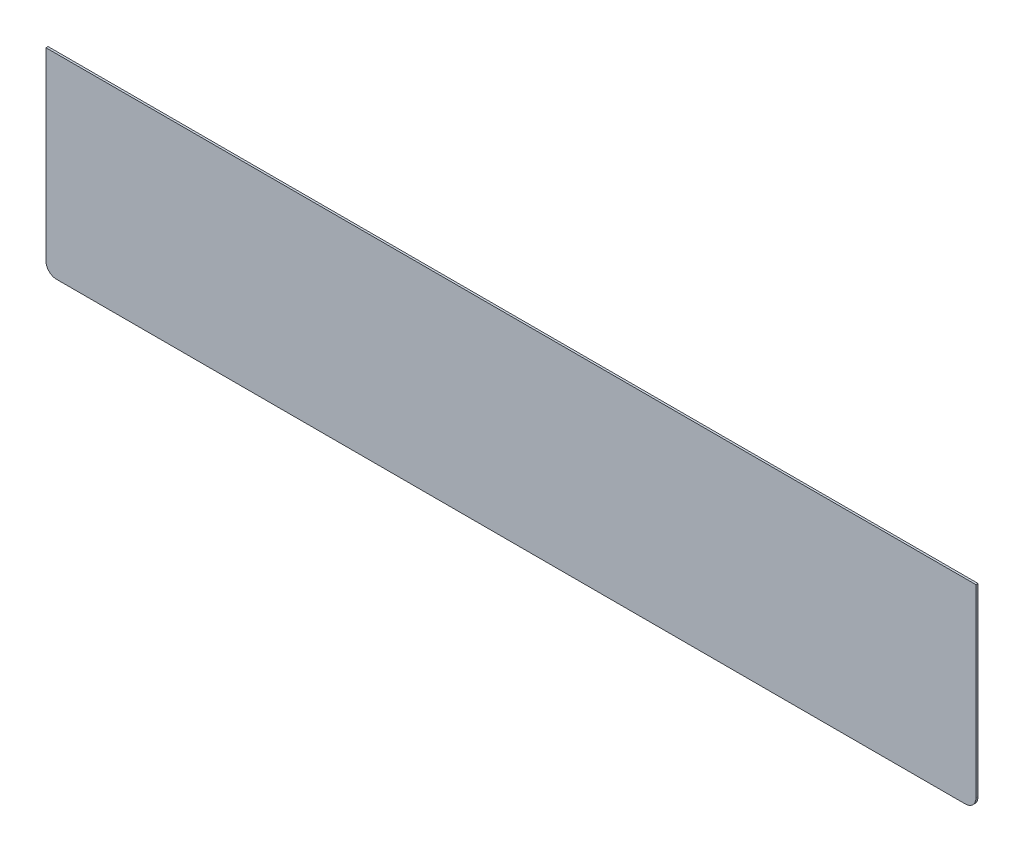
ISO-10303-21;
HEADER;
FILE_DESCRIPTION(('STEP AP214'),'2;1');
FILE_NAME('part.step','',(''),(''),'','','');
FILE_SCHEMA(('AUTOMOTIVE_DESIGN { 1 0 10303 214 1 1 1 1 }'));
ENDSEC;
DATA;
#1=APPLICATION_CONTEXT('core data for automotive mechanical design processes');
#2=APPLICATION_PROTOCOL_DEFINITION('international standard','automotive_design',2000,#1);
#3=PRODUCT_CONTEXT('',#1,'mechanical');
#4=PRODUCT('Part','Part','',(#3));
#5=PRODUCT_RELATED_PRODUCT_CATEGORY('part','',(#4));
#6=PRODUCT_DEFINITION_FORMATION('','',#4);
#7=PRODUCT_DEFINITION_CONTEXT('part definition',#1,'design');
#8=PRODUCT_DEFINITION('design','',#6,#7);
#9=PRODUCT_DEFINITION_SHAPE('','',#8);
#10=(LENGTH_UNIT() NAMED_UNIT(*) SI_UNIT(.MILLI.,.METRE.));
#11=(NAMED_UNIT(*) PLANE_ANGLE_UNIT() SI_UNIT($,.RADIAN.));
#12=(NAMED_UNIT(*) SI_UNIT($,.STERADIAN.) SOLID_ANGLE_UNIT());
#13=UNCERTAINTY_MEASURE_WITH_UNIT(LENGTH_MEASURE(1.E-05),#10,'distance_accuracy_value','');
#14=(GEOMETRIC_REPRESENTATION_CONTEXT(3) GLOBAL_UNCERTAINTY_ASSIGNED_CONTEXT((#13)) GLOBAL_UNIT_ASSIGNED_CONTEXT((#10,
#11,#12)) REPRESENTATION_CONTEXT('',''));
#15=CARTESIAN_POINT('',(0.,0.,0.));
#16=DIRECTION('',(0.,0.,1.));
#17=DIRECTION('',(1.,0.,0.));
#18=AXIS2_PLACEMENT_3D('',#15,#16,#17);
#19=CARTESIAN_POINT('',(220.8,182.985286799942,1.));
#20=DIRECTION('',(-1.,0.,0.));
#21=DIRECTION('',(0.,0.,1.));
#22=AXIS2_PLACEMENT_3D('',#19,#20,#21);
#23=PLANE('',#22);
#24=DIRECTION('',(0.,1.,0.));
#25=VECTOR('',#24,1.);
#26=CARTESIAN_POINT('',(220.8,182.985286799942,1.));
#27=LINE('',#26,#25);
#28=CARTESIAN_POINT('',(220.8,95.2486867999419,1.));
#29=VERTEX_POINT('',#28);
#30=CARTESIAN_POINT('',(220.8,182.985286799942,1.));
#31=VERTEX_POINT('',#30);
#32=EDGE_CURVE('E93',#29,#31,#27,.T.);
#33=ORIENTED_EDGE('',*,*,#32,.F.);
#34=DIRECTION('',(0.,0.,-1.));
#35=VECTOR('',#34,1.);
#36=CARTESIAN_POINT('',(220.8,95.2486867999419,1.));
#37=LINE('',#36,#35);
#38=CARTESIAN_POINT('',(220.8,95.2486867999419,0.));
#39=VERTEX_POINT('',#38);
#40=EDGE_CURVE('E134',#29,#39,#37,.T.);
#41=ORIENTED_EDGE('',*,*,#40,.T.);
#42=DIRECTION('',(0.,1.,0.));
#43=VECTOR('',#42,1.);
#44=CARTESIAN_POINT('',(220.8,182.985286799942,0.));
#45=LINE('',#44,#43);
#46=CARTESIAN_POINT('',(220.8,182.985286799942,0.));
#47=VERTEX_POINT('',#46);
#48=EDGE_CURVE('E125',#39,#47,#45,.T.);
#49=ORIENTED_EDGE('',*,*,#48,.T.);
#50=DIRECTION('',(0.,0.,-1.));
#51=VECTOR('',#50,1.);
#52=CARTESIAN_POINT('',(220.8,182.985286799942,1.));
#53=LINE('',#52,#51);
#54=EDGE_CURVE('E129',#31,#47,#53,.T.);
#55=ORIENTED_EDGE('',*,*,#54,.F.);
#56=EDGE_LOOP('',(#33,#41,#49,#55));
#57=FACE_BOUND('',#56,.T.);
#58=ADVANCED_FACE('F35',(#57),#23,.F.);
#59=CARTESIAN_POINT('',(220.8,182.985286799942,1.));
#60=DIRECTION('',(0.,-1.,0.));
#61=DIRECTION('',(1.,0.,0.));
#62=AXIS2_PLACEMENT_3D('',#59,#60,#61);
#63=PLANE('',#62);
#64=DIRECTION('',(-1.,0.,0.));
#65=VECTOR('',#64,1.);
#66=CARTESIAN_POINT('',(220.8,182.985286799942,0.));
#67=LINE('',#66,#65);
#68=CARTESIAN_POINT('',(-220.8,182.985286799942,0.));
#69=VERTEX_POINT('',#68);
#70=EDGE_CURVE('E103',#47,#69,#67,.T.);
#71=ORIENTED_EDGE('',*,*,#70,.T.);
#72=DIRECTION('',(0.,0.,-1.));
#73=VECTOR('',#72,1.);
#74=CARTESIAN_POINT('',(-220.8,182.985286799942,1.));
#75=LINE('',#74,#73);
#76=CARTESIAN_POINT('',(-220.8,182.985286799942,1.));
#77=VERTEX_POINT('',#76);
#78=EDGE_CURVE('E100',#77,#69,#75,.T.);
#79=ORIENTED_EDGE('',*,*,#78,.F.);
#80=DIRECTION('',(-1.,0.,0.));
#81=VECTOR('',#80,1.);
#82=CARTESIAN_POINT('',(220.8,182.985286799942,1.));
#83=LINE('',#82,#81);
#84=EDGE_CURVE('E86',#31,#77,#83,.T.);
#85=ORIENTED_EDGE('',*,*,#84,.F.);
#86=ORIENTED_EDGE('',*,*,#54,.T.);
#87=EDGE_LOOP('',(#71,#79,#85,#86));
#88=FACE_BOUND('',#87,.T.);
#89=ADVANCED_FACE('F101',(#88),#63,.F.);
#90=CARTESIAN_POINT('',(220.8,90.2486867999418,1.));
#91=DIRECTION('',(0.,1.,0.));
#92=DIRECTION('',(-1.,0.,0.));
#93=AXIS2_PLACEMENT_3D('',#90,#91,#92);
#94=PLANE('',#93);
#95=DIRECTION('',(1.,0.,0.));
#96=VECTOR('',#95,1.);
#97=CARTESIAN_POINT('',(220.8,90.2486867999418,0.));
#98=LINE('',#97,#96);
#99=CARTESIAN_POINT('',(-215.8,90.2486867999417,0.));
#100=VERTEX_POINT('',#99);
#101=CARTESIAN_POINT('',(215.8,90.2486867999418,0.));
#102=VERTEX_POINT('',#101);
#103=EDGE_CURVE('E126',#100,#102,#98,.T.);
#104=ORIENTED_EDGE('',*,*,#103,.T.);
#105=DIRECTION('',(0.,0.,-1.));
#106=VECTOR('',#105,1.);
#107=CARTESIAN_POINT('',(215.8,90.2486867999418,1.));
#108=LINE('',#107,#106);
#109=CARTESIAN_POINT('',(215.8,90.2486867999418,1.));
#110=VERTEX_POINT('',#109);
#111=EDGE_CURVE('E43',#102,#110,#108,.F.);
#112=ORIENTED_EDGE('',*,*,#111,.T.);
#113=DIRECTION('',(1.,0.,0.));
#114=VECTOR('',#113,1.);
#115=CARTESIAN_POINT('',(220.8,90.2486867999418,1.));
#116=LINE('',#115,#114);
#117=CARTESIAN_POINT('',(-215.8,90.2486867999417,1.));
#118=VERTEX_POINT('',#117);
#119=EDGE_CURVE('E97',#118,#110,#116,.T.);
#120=ORIENTED_EDGE('',*,*,#119,.F.);
#121=DIRECTION('',(0.,0.,-1.));
#122=VECTOR('',#121,1.);
#123=CARTESIAN_POINT('',(-215.8,90.2486867999417,1.));
#124=LINE('',#123,#122);
#125=EDGE_CURVE('E120',#100,#118,#124,.F.);
#126=ORIENTED_EDGE('',*,*,#125,.F.);
#127=EDGE_LOOP('',(#104,#112,#120,#126));
#128=FACE_BOUND('',#127,.T.);
#129=ADVANCED_FACE('F156',(#128),#94,.F.);
#130=CARTESIAN_POINT('',(0.,0.,1.));
#131=DIRECTION('',(0.,0.,-1.));
#132=DIRECTION('',(-1.,0.,0.));
#133=AXIS2_PLACEMENT_3D('',#130,#131,#132);
#134=PLANE('',#133);
#135=ORIENTED_EDGE('',*,*,#119,.T.);
#136=CARTESIAN_POINT('',(215.8,95.2486867999419,1.));
#137=DIRECTION('',(0.,0.,-1.));
#138=DIRECTION('',(-1.,0.,0.));
#139=AXIS2_PLACEMENT_3D('',#136,#137,#138);
#140=CIRCLE('',#139,5.);
#141=EDGE_CURVE('E11',#110,#29,#140,.F.);
#142=ORIENTED_EDGE('',*,*,#141,.T.);
#143=ORIENTED_EDGE('',*,*,#32,.T.);
#144=ORIENTED_EDGE('',*,*,#84,.T.);
#145=DIRECTION('',(0.,1.,0.));
#146=VECTOR('',#145,1.);
#147=CARTESIAN_POINT('',(-220.8,182.985286799942,1.));
#148=LINE('',#147,#146);
#149=CARTESIAN_POINT('',(-220.8,95.2486867999417,1.));
#150=VERTEX_POINT('',#149);
#151=EDGE_CURVE('E91',#150,#77,#148,.T.);
#152=ORIENTED_EDGE('',*,*,#151,.F.);
#153=CARTESIAN_POINT('',(-215.8,95.2486867999417,1.));
#154=DIRECTION('',(0.,0.,1.));
#155=DIRECTION('',(1.,0.,0.));
#156=AXIS2_PLACEMENT_3D('',#153,#154,#155);
#157=CIRCLE('',#156,5.);
#158=EDGE_CURVE('E123',#118,#150,#157,.F.);
#159=ORIENTED_EDGE('',*,*,#158,.F.);
#160=EDGE_LOOP('',(#135,#142,#143,#144,#152,#159));
#161=FACE_BOUND('',#160,.T.);
#162=ADVANCED_FACE('F88',(#161),#134,.F.);
#163=CARTESIAN_POINT('',(0.,0.,0.));
#164=DIRECTION('',(0.,0.,-1.));
#165=DIRECTION('',(-1.,0.,0.));
#166=AXIS2_PLACEMENT_3D('',#163,#164,#165);
#167=PLANE('',#166);
#168=ORIENTED_EDGE('',*,*,#48,.F.);
#169=CARTESIAN_POINT('',(215.8,95.2486867999419,0.));
#170=DIRECTION('',(0.,0.,-1.));
#171=DIRECTION('',(-1.,0.,0.));
#172=AXIS2_PLACEMENT_3D('',#169,#170,#171);
#173=CIRCLE('',#172,5.);
#174=EDGE_CURVE('E57',#39,#102,#173,.T.);
#175=ORIENTED_EDGE('',*,*,#174,.T.);
#176=ORIENTED_EDGE('',*,*,#103,.F.);
#177=CARTESIAN_POINT('',(-215.8,95.2486867999417,0.));
#178=DIRECTION('',(0.,0.,1.));
#179=DIRECTION('',(1.,0.,0.));
#180=AXIS2_PLACEMENT_3D('',#177,#178,#179);
#181=CIRCLE('',#180,5.);
#182=CARTESIAN_POINT('',(-220.8,95.2486867999417,0.));
#183=VERTEX_POINT('',#182);
#184=EDGE_CURVE('E117',#183,#100,#181,.T.);
#185=ORIENTED_EDGE('',*,*,#184,.F.);
#186=DIRECTION('',(0.,1.,0.));
#187=VECTOR('',#186,1.);
#188=CARTESIAN_POINT('',(-220.8,182.985286799942,0.));
#189=LINE('',#188,#187);
#190=EDGE_CURVE('E112',#183,#69,#189,.T.);
#191=ORIENTED_EDGE('',*,*,#190,.T.);
#192=ORIENTED_EDGE('',*,*,#70,.F.);
#193=EDGE_LOOP('',(#168,#175,#176,#185,#191,#192));
#194=FACE_BOUND('',#193,.T.);
#195=ADVANCED_FACE('F141',(#194),#167,.T.);
#196=CARTESIAN_POINT('',(215.8,95.2486867999419,1.));
#197=DIRECTION('',(0.,0.,-1.));
#198=DIRECTION('',(-1.,0.,0.));
#199=AXIS2_PLACEMENT_3D('',#196,#197,#198);
#200=CYLINDRICAL_SURFACE('',#199,5.);
#201=ORIENTED_EDGE('',*,*,#141,.F.);
#202=ORIENTED_EDGE('',*,*,#111,.F.);
#203=ORIENTED_EDGE('',*,*,#174,.F.);
#204=ORIENTED_EDGE('',*,*,#40,.F.);
#205=EDGE_LOOP('',(#201,#202,#203,#204));
#206=FACE_BOUND('',#205,.T.);
#207=ADVANCED_FACE('F37',(#206),#200,.T.);
#208=CARTESIAN_POINT('',(-220.8,182.985286799942,1.));
#209=DIRECTION('',(1.,0.,0.));
#210=DIRECTION('',(0.,0.,1.));
#211=AXIS2_PLACEMENT_3D('',#208,#209,#210);
#212=PLANE('',#211);
#213=ORIENTED_EDGE('',*,*,#151,.T.);
#214=ORIENTED_EDGE('',*,*,#78,.T.);
#215=ORIENTED_EDGE('',*,*,#190,.F.);
#216=DIRECTION('',(0.,0.,-1.));
#217=VECTOR('',#216,1.);
#218=CARTESIAN_POINT('',(-220.8,95.2486867999417,1.));
#219=LINE('',#218,#217);
#220=EDGE_CURVE('E107',#150,#183,#219,.T.);
#221=ORIENTED_EDGE('',*,*,#220,.F.);
#222=EDGE_LOOP('',(#213,#214,#215,#221));
#223=FACE_BOUND('',#222,.T.);
#224=ADVANCED_FACE('F110',(#223),#212,.F.);
#225=CARTESIAN_POINT('',(-215.8,95.2486867999417,1.));
#226=DIRECTION('',(0.,0.,-1.));
#227=DIRECTION('',(1.,0.,0.));
#228=AXIS2_PLACEMENT_3D('',#225,#226,#227);
#229=CYLINDRICAL_SURFACE('',#228,5.);
#230=ORIENTED_EDGE('',*,*,#158,.T.);
#231=ORIENTED_EDGE('',*,*,#220,.T.);
#232=ORIENTED_EDGE('',*,*,#184,.T.);
#233=ORIENTED_EDGE('',*,*,#125,.T.);
#234=EDGE_LOOP('',(#230,#231,#232,#233));
#235=FACE_BOUND('',#234,.T.);
#236=ADVANCED_FACE('F144',(#235),#229,.T.);
#237=CLOSED_SHELL('',(#58,#89,#129,#162,#195,#207,#224,#236));
#238=MANIFOLD_SOLID_BREP('B2',#237);
#239=ADVANCED_BREP_SHAPE_REPRESENTATION('',(#18,#238),#14);
#240=SHAPE_DEFINITION_REPRESENTATION(#9,#239);
ENDSEC;
END-ISO-10303-21;
